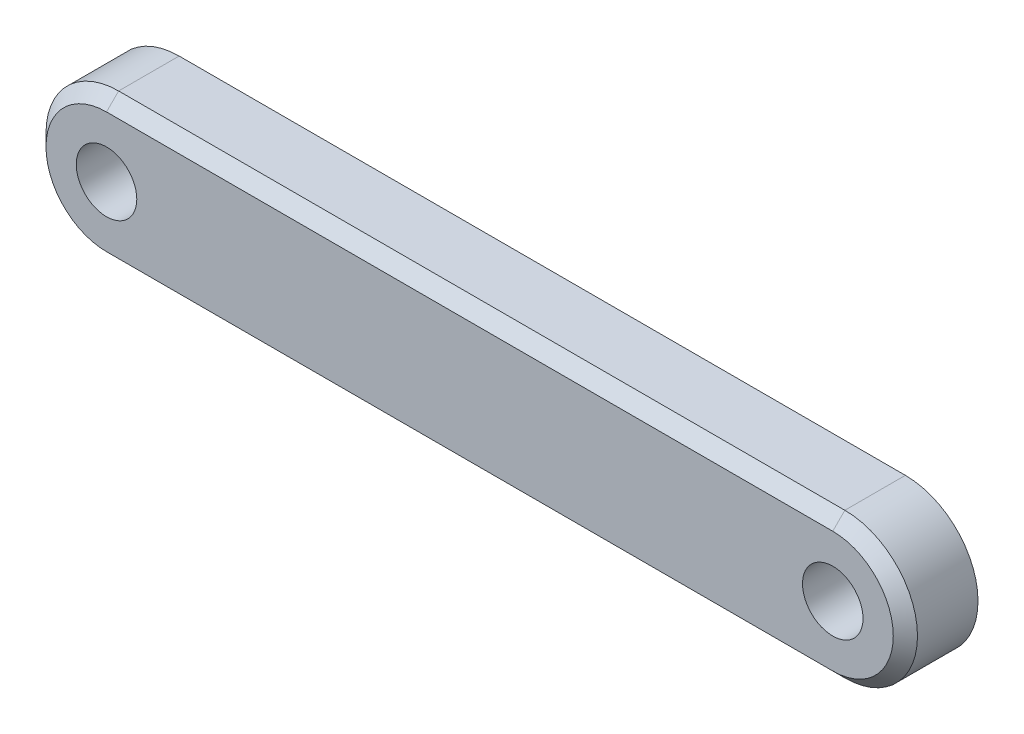
ISO-10303-21;
HEADER;
FILE_DESCRIPTION(('STEP AP214'),'2;1');
FILE_NAME('part.step','',(''),(''),'','','');
FILE_SCHEMA(('AUTOMOTIVE_DESIGN { 1 0 10303 214 1 1 1 1 }'));
ENDSEC;
DATA;
#1=APPLICATION_CONTEXT('core data for automotive mechanical design processes');
#2=APPLICATION_PROTOCOL_DEFINITION('international standard','automotive_design',2000,#1);
#3=PRODUCT_CONTEXT('',#1,'mechanical');
#4=PRODUCT('Part','Part','',(#3));
#5=PRODUCT_RELATED_PRODUCT_CATEGORY('part','',(#4));
#6=PRODUCT_DEFINITION_FORMATION('','',#4);
#7=PRODUCT_DEFINITION_CONTEXT('part definition',#1,'design');
#8=PRODUCT_DEFINITION('design','',#6,#7);
#9=PRODUCT_DEFINITION_SHAPE('','',#8);
#10=(LENGTH_UNIT() NAMED_UNIT(*) SI_UNIT(.MILLI.,.METRE.));
#11=(NAMED_UNIT(*) PLANE_ANGLE_UNIT() SI_UNIT($,.RADIAN.));
#12=(NAMED_UNIT(*) SI_UNIT($,.STERADIAN.) SOLID_ANGLE_UNIT());
#13=UNCERTAINTY_MEASURE_WITH_UNIT(LENGTH_MEASURE(1.E-05),#10,'distance_accuracy_value','');
#14=(GEOMETRIC_REPRESENTATION_CONTEXT(3) GLOBAL_UNCERTAINTY_ASSIGNED_CONTEXT((#13)) GLOBAL_UNIT_ASSIGNED_CONTEXT((#10,
#11,#12)) REPRESENTATION_CONTEXT('',''));
#15=CARTESIAN_POINT('',(0.,0.,0.));
#16=DIRECTION('',(0.,0.,1.));
#17=DIRECTION('',(1.,0.,0.));
#18=AXIS2_PLACEMENT_3D('',#15,#16,#17);
#19=CARTESIAN_POINT('',(0.,0.,3.));
#20=DIRECTION('',(0.,0.,1.));
#21=DIRECTION('',(1.,0.,0.));
#22=AXIS2_PLACEMENT_3D('',#19,#20,#21);
#23=PLANE('',#22);
#24=CARTESIAN_POINT('',(0.,0.,3.));
#25=DIRECTION('',(0.,0.,1.));
#26=DIRECTION('',(1.,0.,0.));
#27=AXIS2_PLACEMENT_3D('',#24,#25,#26);
#28=CIRCLE('',#27,2.5);
#29=CARTESIAN_POINT('',(0.,2.5,3.));
#30=VERTEX_POINT('',#29);
#31=CARTESIAN_POINT('',(0.,-2.5,3.));
#32=VERTEX_POINT('',#31);
#33=EDGE_CURVE('E163',#30,#32,#28,.T.);
#34=ORIENTED_EDGE('',*,*,#33,.T.);
#35=DIRECTION('',(1.,0.,0.));
#36=VECTOR('',#35,1.);
#37=CARTESIAN_POINT('',(30.,-2.5,3.));
#38=LINE('',#37,#36);
#39=CARTESIAN_POINT('',(30.,-2.5,3.));
#40=VERTEX_POINT('',#39);
#41=EDGE_CURVE('E169',#32,#40,#38,.T.);
#42=ORIENTED_EDGE('',*,*,#41,.T.);
#43=CARTESIAN_POINT('',(30.,0.,3.));
#44=DIRECTION('',(0.,0.,1.));
#45=DIRECTION('',(1.,0.,0.));
#46=AXIS2_PLACEMENT_3D('',#43,#44,#45);
#47=CIRCLE('',#46,2.5);
#48=CARTESIAN_POINT('',(30.,2.5,3.));
#49=VERTEX_POINT('',#48);
#50=EDGE_CURVE('E166',#40,#49,#47,.T.);
#51=ORIENTED_EDGE('',*,*,#50,.T.);
#52=DIRECTION('',(-1.,0.,0.));
#53=VECTOR('',#52,1.);
#54=CARTESIAN_POINT('',(0.,2.5,3.));
#55=LINE('',#54,#53);
#56=EDGE_CURVE('E124',#49,#30,#55,.T.);
#57=ORIENTED_EDGE('',*,*,#56,.T.);
#58=EDGE_LOOP('',(#34,#42,#51,#57));
#59=FACE_BOUND('',#58,.T.);
#60=CARTESIAN_POINT('',(30.,0.,3.));
#61=DIRECTION('',(0.,0.,1.));
#62=DIRECTION('',(1.,0.,0.));
#63=AXIS2_PLACEMENT_3D('',#60,#61,#62);
#64=CIRCLE('',#63,1.25);
#65=CARTESIAN_POINT('',(31.25,0.,3.));
#66=VERTEX_POINT('',#65);
#67=EDGE_CURVE('E141',#66,#66,#64,.T.);
#68=ORIENTED_EDGE('',*,*,#67,.F.);
#69=EDGE_LOOP('',(#68));
#70=FACE_BOUND('',#69,.T.);
#71=CARTESIAN_POINT('',(0.,0.,3.));
#72=DIRECTION('',(0.,0.,1.));
#73=DIRECTION('',(1.,0.,0.));
#74=AXIS2_PLACEMENT_3D('',#71,#72,#73);
#75=CIRCLE('',#74,1.25);
#76=CARTESIAN_POINT('',(1.25,0.,3.));
#77=VERTEX_POINT('',#76);
#78=EDGE_CURVE('E197',#77,#77,#75,.T.);
#79=ORIENTED_EDGE('',*,*,#78,.F.);
#80=EDGE_LOOP('',(#79));
#81=FACE_BOUND('',#80,.T.);
#82=ADVANCED_FACE('F52',(#59,#70,#81),#23,.T.);
#83=CARTESIAN_POINT('',(0.,0.,0.));
#84=DIRECTION('',(0.,0.,1.));
#85=DIRECTION('',(1.,0.,0.));
#86=AXIS2_PLACEMENT_3D('',#83,#84,#85);
#87=PLANE('',#86);
#88=CARTESIAN_POINT('',(0.,0.,0.));
#89=DIRECTION('',(0.,0.,1.));
#90=DIRECTION('',(1.,0.,0.));
#91=AXIS2_PLACEMENT_3D('',#88,#89,#90);
#92=CIRCLE('',#91,3.);
#93=CARTESIAN_POINT('',(0.,3.,0.));
#94=VERTEX_POINT('',#93);
#95=CARTESIAN_POINT('',(0.,-3.,0.));
#96=VERTEX_POINT('',#95);
#97=EDGE_CURVE('E132',#94,#96,#92,.T.);
#98=ORIENTED_EDGE('',*,*,#97,.F.);
#99=DIRECTION('',(-1.,0.,0.));
#100=VECTOR('',#99,1.);
#101=CARTESIAN_POINT('',(0.,3.,0.));
#102=LINE('',#101,#100);
#103=CARTESIAN_POINT('',(30.,3.,0.));
#104=VERTEX_POINT('',#103);
#105=EDGE_CURVE('E153',#104,#94,#102,.T.);
#106=ORIENTED_EDGE('',*,*,#105,.F.);
#107=CARTESIAN_POINT('',(30.,0.,0.));
#108=DIRECTION('',(0.,0.,1.));
#109=DIRECTION('',(1.,0.,0.));
#110=AXIS2_PLACEMENT_3D('',#107,#108,#109);
#111=CIRCLE('',#110,3.);
#112=CARTESIAN_POINT('',(30.,-3.,0.));
#113=VERTEX_POINT('',#112);
#114=EDGE_CURVE('E134',#113,#104,#111,.T.);
#115=ORIENTED_EDGE('',*,*,#114,.F.);
#116=DIRECTION('',(1.,0.,0.));
#117=VECTOR('',#116,1.);
#118=CARTESIAN_POINT('',(0.,-3.,0.));
#119=LINE('',#118,#117);
#120=EDGE_CURVE('E118',#96,#113,#119,.T.);
#121=ORIENTED_EDGE('',*,*,#120,.F.);
#122=EDGE_LOOP('',(#98,#106,#115,#121));
#123=FACE_BOUND('',#122,.T.);
#124=CARTESIAN_POINT('',(30.,0.,0.));
#125=DIRECTION('',(0.,0.,1.));
#126=DIRECTION('',(1.,0.,0.));
#127=AXIS2_PLACEMENT_3D('',#124,#125,#126);
#128=CIRCLE('',#127,1.25);
#129=CARTESIAN_POINT('',(31.25,0.,0.));
#130=VERTEX_POINT('',#129);
#131=EDGE_CURVE('E147',#130,#130,#128,.T.);
#132=ORIENTED_EDGE('',*,*,#131,.T.);
#133=EDGE_LOOP('',(#132));
#134=FACE_BOUND('',#133,.T.);
#135=CARTESIAN_POINT('',(0.,0.,0.));
#136=DIRECTION('',(0.,0.,1.));
#137=DIRECTION('',(1.,0.,0.));
#138=AXIS2_PLACEMENT_3D('',#135,#136,#137);
#139=CIRCLE('',#138,1.25);
#140=CARTESIAN_POINT('',(1.25,0.,0.));
#141=VERTEX_POINT('',#140);
#142=EDGE_CURVE('E192',#141,#141,#139,.T.);
#143=ORIENTED_EDGE('',*,*,#142,.T.);
#144=EDGE_LOOP('',(#143));
#145=FACE_BOUND('',#144,.T.);
#146=ADVANCED_FACE('F129',(#123,#134,#145),#87,.F.);
#147=CARTESIAN_POINT('',(0.,0.,3.));
#148=DIRECTION('',(0.,0.,-1.));
#149=DIRECTION('',(-1.,0.,0.));
#150=AXIS2_PLACEMENT_3D('',#147,#148,#149);
#151=CYLINDRICAL_SURFACE('',#150,3.);
#152=DIRECTION('',(0.,0.,-1.));
#153=VECTOR('',#152,1.);
#154=CARTESIAN_POINT('',(0.,-3.,3.));
#155=LINE('',#154,#153);
#156=CARTESIAN_POINT('',(0.,-3.,2.5));
#157=VERTEX_POINT('',#156);
#158=EDGE_CURVE('E114',#157,#96,#155,.T.);
#159=ORIENTED_EDGE('',*,*,#158,.F.);
#160=CARTESIAN_POINT('',(0.,0.,2.5));
#161=DIRECTION('',(0.,0.,1.));
#162=DIRECTION('',(1.,0.,0.));
#163=AXIS2_PLACEMENT_3D('',#160,#161,#162);
#164=CIRCLE('',#163,3.);
#165=CARTESIAN_POINT('',(0.,3.,2.5));
#166=VERTEX_POINT('',#165);
#167=EDGE_CURVE('E63',#157,#166,#164,.F.);
#168=ORIENTED_EDGE('',*,*,#167,.T.);
#169=DIRECTION('',(0.,0.,-1.));
#170=VECTOR('',#169,1.);
#171=CARTESIAN_POINT('',(0.,3.,3.));
#172=LINE('',#171,#170);
#173=EDGE_CURVE('E138',#166,#94,#172,.T.);
#174=ORIENTED_EDGE('',*,*,#173,.T.);
#175=ORIENTED_EDGE('',*,*,#97,.T.);
#176=EDGE_LOOP('',(#159,#168,#174,#175));
#177=FACE_BOUND('',#176,.T.);
#178=ADVANCED_FACE('F137',(#177),#151,.T.);
#179=CARTESIAN_POINT('',(0.,-3.,3.));
#180=DIRECTION('',(0.,1.,0.));
#181=DIRECTION('',(0.,0.,1.));
#182=AXIS2_PLACEMENT_3D('',#179,#180,#181);
#183=PLANE('',#182);
#184=DIRECTION('',(0.,0.,-1.));
#185=VECTOR('',#184,1.);
#186=CARTESIAN_POINT('',(30.,-3.,3.));
#187=LINE('',#186,#185);
#188=CARTESIAN_POINT('',(30.,-3.,2.5));
#189=VERTEX_POINT('',#188);
#190=EDGE_CURVE('E125',#189,#113,#187,.T.);
#191=ORIENTED_EDGE('',*,*,#190,.F.);
#192=DIRECTION('',(-1.,0.,0.));
#193=VECTOR('',#192,1.);
#194=CARTESIAN_POINT('',(0.,-3.,2.5));
#195=LINE('',#194,#193);
#196=EDGE_CURVE('E121',#189,#157,#195,.T.);
#197=ORIENTED_EDGE('',*,*,#196,.T.);
#198=ORIENTED_EDGE('',*,*,#158,.T.);
#199=ORIENTED_EDGE('',*,*,#120,.T.);
#200=EDGE_LOOP('',(#191,#197,#198,#199));
#201=FACE_BOUND('',#200,.T.);
#202=ADVANCED_FACE('F117',(#201),#183,.F.);
#203=CARTESIAN_POINT('',(30.,0.,3.));
#204=DIRECTION('',(0.,0.,-1.));
#205=DIRECTION('',(-1.,0.,0.));
#206=AXIS2_PLACEMENT_3D('',#203,#204,#205);
#207=CYLINDRICAL_SURFACE('',#206,3.);
#208=DIRECTION('',(0.,0.,-1.));
#209=VECTOR('',#208,1.);
#210=CARTESIAN_POINT('',(30.,3.,3.));
#211=LINE('',#210,#209);
#212=CARTESIAN_POINT('',(30.,3.,2.5));
#213=VERTEX_POINT('',#212);
#214=EDGE_CURVE('E157',#213,#104,#211,.T.);
#215=ORIENTED_EDGE('',*,*,#214,.F.);
#216=CARTESIAN_POINT('',(30.,0.,2.5));
#217=DIRECTION('',(0.,0.,1.));
#218=DIRECTION('',(1.,0.,0.));
#219=AXIS2_PLACEMENT_3D('',#216,#217,#218);
#220=CIRCLE('',#219,3.);
#221=EDGE_CURVE('E175',#213,#189,#220,.F.);
#222=ORIENTED_EDGE('',*,*,#221,.T.);
#223=ORIENTED_EDGE('',*,*,#190,.T.);
#224=ORIENTED_EDGE('',*,*,#114,.T.);
#225=EDGE_LOOP('',(#215,#222,#223,#224));
#226=FACE_BOUND('',#225,.T.);
#227=ADVANCED_FACE('F221',(#226),#207,.T.);
#228=CARTESIAN_POINT('',(0.,3.,3.));
#229=DIRECTION('',(0.,-1.,0.));
#230=DIRECTION('',(0.,0.,-1.));
#231=AXIS2_PLACEMENT_3D('',#228,#229,#230);
#232=PLANE('',#231);
#233=ORIENTED_EDGE('',*,*,#173,.F.);
#234=DIRECTION('',(1.,0.,0.));
#235=VECTOR('',#234,1.);
#236=CARTESIAN_POINT('',(30.,3.,2.5));
#237=LINE('',#236,#235);
#238=EDGE_CURVE('E11',#166,#213,#237,.T.);
#239=ORIENTED_EDGE('',*,*,#238,.T.);
#240=ORIENTED_EDGE('',*,*,#214,.T.);
#241=ORIENTED_EDGE('',*,*,#105,.T.);
#242=EDGE_LOOP('',(#233,#239,#240,#241));
#243=FACE_BOUND('',#242,.T.);
#244=ADVANCED_FACE('F213',(#243),#232,.F.);
#245=CARTESIAN_POINT('',(30.,0.,3.));
#246=DIRECTION('',(0.,0.,-1.));
#247=DIRECTION('',(-1.,0.,0.));
#248=AXIS2_PLACEMENT_3D('',#245,#246,#247);
#249=CYLINDRICAL_SURFACE('',#248,1.25);
#250=ORIENTED_EDGE('',*,*,#67,.T.);
#251=EDGE_LOOP('',(#250));
#252=FACE_BOUND('',#251,.T.);
#253=ORIENTED_EDGE('',*,*,#131,.F.);
#254=EDGE_LOOP('',(#253));
#255=FACE_BOUND('',#254,.T.);
#256=ADVANCED_FACE('F210',(#252,#255),#249,.F.);
#257=CARTESIAN_POINT('',(0.,0.,3.));
#258=DIRECTION('',(0.,0.,-1.));
#259=DIRECTION('',(-1.,0.,0.));
#260=AXIS2_PLACEMENT_3D('',#257,#258,#259);
#261=CYLINDRICAL_SURFACE('',#260,1.25);
#262=ORIENTED_EDGE('',*,*,#78,.T.);
#263=EDGE_LOOP('',(#262));
#264=FACE_BOUND('',#263,.T.);
#265=ORIENTED_EDGE('',*,*,#142,.F.);
#266=EDGE_LOOP('',(#265));
#267=FACE_BOUND('',#266,.T.);
#268=ADVANCED_FACE('F212',(#264,#267),#261,.F.);
#269=CARTESIAN_POINT('',(0.,2.5,3.));
#270=DIRECTION('',(0.,0.70710678118655,0.707106781186545));
#271=DIRECTION('',(1.,0.,0.));
#272=AXIS2_PLACEMENT_3D('',#269,#270,#271);
#273=PLANE('',#272);
#274=DIRECTION('',(0.,-0.707106781186545,0.70710678118655));
#275=VECTOR('',#274,1.);
#276=CARTESIAN_POINT('',(30.,3.,2.5));
#277=LINE('',#276,#275);
#278=EDGE_CURVE('E185',#213,#49,#277,.T.);
#279=ORIENTED_EDGE('',*,*,#278,.F.);
#280=ORIENTED_EDGE('',*,*,#238,.F.);
#281=DIRECTION('',(0.,0.707106781186545,-0.70710678118655));
#282=VECTOR('',#281,1.);
#283=CARTESIAN_POINT('',(0.,2.5,3.));
#284=LINE('',#283,#282);
#285=EDGE_CURVE('E57',#30,#166,#284,.T.);
#286=ORIENTED_EDGE('',*,*,#285,.F.);
#287=ORIENTED_EDGE('',*,*,#56,.F.);
#288=EDGE_LOOP('',(#279,#280,#286,#287));
#289=FACE_BOUND('',#288,.T.);
#290=ADVANCED_FACE('F55',(#289),#273,.T.);
#291=CARTESIAN_POINT('',(0.,0.,3.));
#292=DIRECTION('',(0.,0.,-1.));
#293=DIRECTION('',(-1.,0.,0.));
#294=AXIS2_PLACEMENT_3D('',#291,#292,#293);
#295=CONICAL_SURFACE('',#294,2.5,0.785398163397445);
#296=ORIENTED_EDGE('',*,*,#285,.T.);
#297=ORIENTED_EDGE('',*,*,#167,.F.);
#298=DIRECTION('',(0.,-0.707106781186545,-0.70710678118655));
#299=VECTOR('',#298,1.);
#300=CARTESIAN_POINT('',(0.,-2.5,3.));
#301=LINE('',#300,#299);
#302=EDGE_CURVE('E183',#32,#157,#301,.T.);
#303=ORIENTED_EDGE('',*,*,#302,.F.);
#304=ORIENTED_EDGE('',*,*,#33,.F.);
#305=EDGE_LOOP('',(#296,#297,#303,#304));
#306=FACE_BOUND('',#305,.T.);
#307=ADVANCED_FACE('F252',(#306),#295,.T.);
#308=CARTESIAN_POINT('',(30.,0.,3.));
#309=DIRECTION('',(0.,0.,-1.));
#310=DIRECTION('',(-1.,0.,0.));
#311=AXIS2_PLACEMENT_3D('',#308,#309,#310);
#312=CONICAL_SURFACE('',#311,2.5,0.785398163397445);
#313=ORIENTED_EDGE('',*,*,#278,.T.);
#314=ORIENTED_EDGE('',*,*,#50,.F.);
#315=DIRECTION('',(0.,0.707106781186545,0.70710678118655));
#316=VECTOR('',#315,1.);
#317=CARTESIAN_POINT('',(30.,-3.,2.5));
#318=LINE('',#317,#316);
#319=EDGE_CURVE('E180',#189,#40,#318,.T.);
#320=ORIENTED_EDGE('',*,*,#319,.F.);
#321=ORIENTED_EDGE('',*,*,#221,.F.);
#322=EDGE_LOOP('',(#313,#314,#320,#321));
#323=FACE_BOUND('',#322,.T.);
#324=ADVANCED_FACE('F246',(#323),#312,.T.);
#325=CARTESIAN_POINT('',(0.,-2.5,3.));
#326=DIRECTION('',(0.,-0.70710678118655,0.707106781186545));
#327=DIRECTION('',(-1.,0.,0.));
#328=AXIS2_PLACEMENT_3D('',#325,#326,#327);
#329=PLANE('',#328);
#330=ORIENTED_EDGE('',*,*,#302,.T.);
#331=ORIENTED_EDGE('',*,*,#196,.F.);
#332=ORIENTED_EDGE('',*,*,#319,.T.);
#333=ORIENTED_EDGE('',*,*,#41,.F.);
#334=EDGE_LOOP('',(#330,#331,#332,#333));
#335=FACE_BOUND('',#334,.T.);
#336=ADVANCED_FACE('F240',(#335),#329,.T.);
#337=CLOSED_SHELL('',(#82,#146,#178,#202,#227,#244,#256,#268,#290,#307,#324,#336));
#338=MANIFOLD_SOLID_BREP('B2',#337);
#339=ADVANCED_BREP_SHAPE_REPRESENTATION('',(#18,#338),#14);
#340=SHAPE_DEFINITION_REPRESENTATION(#9,#339);
ENDSEC;
END-ISO-10303-21;
